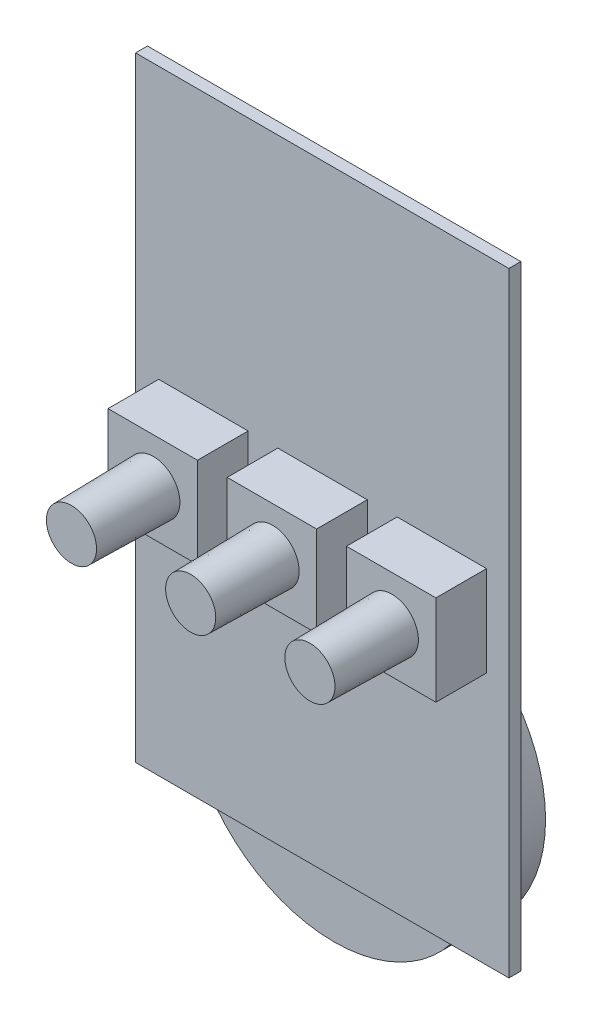
ISO-10303-21;
HEADER;
FILE_DESCRIPTION(('STEP AP214'),'2;1');
FILE_NAME('part.step','',(''),(''),'','','');
FILE_SCHEMA(('AUTOMOTIVE_DESIGN { 1 0 10303 214 1 1 1 1 }'));
ENDSEC;
DATA;
#1=APPLICATION_CONTEXT('core data for automotive mechanical design processes');
#2=APPLICATION_PROTOCOL_DEFINITION('international standard','automotive_design',2000,#1);
#3=PRODUCT_CONTEXT('',#1,'mechanical');
#4=PRODUCT('Part','Part','',(#3));
#5=PRODUCT_RELATED_PRODUCT_CATEGORY('part','',(#4));
#6=PRODUCT_DEFINITION_FORMATION('','',#4);
#7=PRODUCT_DEFINITION_CONTEXT('part definition',#1,'design');
#8=PRODUCT_DEFINITION('design','',#6,#7);
#9=PRODUCT_DEFINITION_SHAPE('','',#8);
#10=(LENGTH_UNIT() NAMED_UNIT(*) SI_UNIT(.MILLI.,.METRE.));
#11=(NAMED_UNIT(*) PLANE_ANGLE_UNIT() SI_UNIT($,.RADIAN.));
#12=(NAMED_UNIT(*) SI_UNIT($,.STERADIAN.) SOLID_ANGLE_UNIT());
#13=UNCERTAINTY_MEASURE_WITH_UNIT(LENGTH_MEASURE(1.E-05),#10,'distance_accuracy_value','');
#14=(GEOMETRIC_REPRESENTATION_CONTEXT(3) GLOBAL_UNCERTAINTY_ASSIGNED_CONTEXT((#13)) GLOBAL_UNIT_ASSIGNED_CONTEXT((#10,
#11,#12)) REPRESENTATION_CONTEXT('',''));
#15=CARTESIAN_POINT('',(0.,0.,0.));
#16=DIRECTION('',(0.,0.,1.));
#17=DIRECTION('',(1.,0.,0.));
#18=AXIS2_PLACEMENT_3D('',#15,#16,#17);
#19=CARTESIAN_POINT('',(0.,0.,3.4));
#20=DIRECTION('',(0.,0.,1.));
#21=DIRECTION('',(1.,0.,0.));
#22=AXIS2_PLACEMENT_3D('',#19,#20,#21);
#23=PLANE('',#22);
#24=DIRECTION('',(0.,-1.,0.));
#25=VECTOR('',#24,1.);
#26=CARTESIAN_POINT('',(17.5516685380828,23.0389617054669,3.4));
#27=LINE('',#26,#25);
#28=CARTESIAN_POINT('',(17.5516685380828,23.0389617054669,3.4));
#29=VERTEX_POINT('',#28);
#30=CARTESIAN_POINT('',(17.5516685380828,16.9751553210773,3.4));
#31=VERTEX_POINT('',#30);
#32=EDGE_CURVE('E375',#29,#31,#27,.T.);
#33=ORIENTED_EDGE('',*,*,#32,.T.);
#34=DIRECTION('',(1.,0.,0.));
#35=VECTOR('',#34,1.);
#36=CARTESIAN_POINT('',(17.5516685380828,16.9751553210773,3.4));
#37=LINE('',#36,#35);
#38=CARTESIAN_POINT('',(23.5516685380828,16.9751553210773,3.4));
#39=VERTEX_POINT('',#38);
#40=EDGE_CURVE('E377',#31,#39,#37,.T.);
#41=ORIENTED_EDGE('',*,*,#40,.T.);
#42=DIRECTION('',(0.,1.,0.));
#43=VECTOR('',#42,1.);
#44=CARTESIAN_POINT('',(23.5516685380828,23.0389617054669,3.4));
#45=LINE('',#44,#43);
#46=CARTESIAN_POINT('',(23.5516685380828,23.0389617054669,3.4));
#47=VERTEX_POINT('',#46);
#48=EDGE_CURVE('E380',#39,#47,#45,.T.);
#49=ORIENTED_EDGE('',*,*,#48,.T.);
#50=DIRECTION('',(-1.,0.,0.));
#51=VECTOR('',#50,1.);
#52=CARTESIAN_POINT('',(17.5516685380828,23.0389617054669,3.4));
#53=LINE('',#52,#51);
#54=EDGE_CURVE('E382',#47,#29,#53,.T.);
#55=ORIENTED_EDGE('',*,*,#54,.T.);
#56=EDGE_LOOP('',(#33,#41,#49,#55));
#57=FACE_BOUND('',#56,.T.);
#58=CARTESIAN_POINT('',(20.6,20.,3.4));
#59=DIRECTION('',(0.,0.,1.));
#60=DIRECTION('',(1.,0.,0.));
#61=AXIS2_PLACEMENT_3D('',#58,#59,#60);
#62=CIRCLE('',#61,1.778);
#63=CARTESIAN_POINT('',(22.378,20.,3.4));
#64=VERTEX_POINT('',#63);
#65=EDGE_CURVE('E416',#64,#64,#62,.T.);
#66=ORIENTED_EDGE('',*,*,#65,.F.);
#67=EDGE_LOOP('',(#66));
#68=FACE_BOUND('',#67,.T.);
#69=ADVANCED_FACE('F33',(#57,#68),#23,.T.);
#70=CARTESIAN_POINT('',(0.,0.,3.4));
#71=DIRECTION('',(0.,0.,1.));
#72=DIRECTION('',(1.,0.,0.));
#73=AXIS2_PLACEMENT_3D('',#70,#71,#72);
#74=PLANE('',#73);
#75=DIRECTION('',(0.,-1.,0.));
#76=VECTOR('',#75,1.);
#77=CARTESIAN_POINT('',(9.54638471172548,23.0389617054669,3.4));
#78=LINE('',#77,#76);
#79=CARTESIAN_POINT('',(9.54638471172548,23.0389617054669,3.4));
#80=VERTEX_POINT('',#79);
#81=CARTESIAN_POINT('',(9.54638471172548,16.9751553210773,3.4));
#82=VERTEX_POINT('',#81);
#83=EDGE_CURVE('E310',#80,#82,#78,.T.);
#84=ORIENTED_EDGE('',*,*,#83,.T.);
#85=DIRECTION('',(1.,0.,0.));
#86=VECTOR('',#85,1.);
#87=CARTESIAN_POINT('',(9.54638471172548,16.9751553210773,3.4));
#88=LINE('',#87,#86);
#89=CARTESIAN_POINT('',(15.5463847117255,16.9751553210773,3.4));
#90=VERTEX_POINT('',#89);
#91=EDGE_CURVE('E401',#82,#90,#88,.T.);
#92=ORIENTED_EDGE('',*,*,#91,.T.);
#93=DIRECTION('',(0.,1.,0.));
#94=VECTOR('',#93,1.);
#95=CARTESIAN_POINT('',(15.5463847117255,23.0389617054669,3.4));
#96=LINE('',#95,#94);
#97=CARTESIAN_POINT('',(15.5463847117255,23.0389617054669,3.4));
#98=VERTEX_POINT('',#97);
#99=EDGE_CURVE('E403',#90,#98,#96,.T.);
#100=ORIENTED_EDGE('',*,*,#99,.T.);
#101=DIRECTION('',(-1.,0.,0.));
#102=VECTOR('',#101,1.);
#103=CARTESIAN_POINT('',(9.54638471172548,23.0389617054669,3.4));
#104=LINE('',#103,#102);
#105=EDGE_CURVE('E315',#98,#80,#104,.T.);
#106=ORIENTED_EDGE('',*,*,#105,.T.);
#107=EDGE_LOOP('',(#84,#92,#100,#106));
#108=FACE_BOUND('',#107,.T.);
#109=CARTESIAN_POINT('',(12.6,20.,3.4));
#110=DIRECTION('',(0.,0.,1.));
#111=DIRECTION('',(1.,0.,0.));
#112=AXIS2_PLACEMENT_3D('',#109,#110,#111);
#113=CIRCLE('',#112,1.778);
#114=CARTESIAN_POINT('',(14.378,20.,3.4));
#115=VERTEX_POINT('',#114);
#116=EDGE_CURVE('E371',#115,#115,#113,.T.);
#117=ORIENTED_EDGE('',*,*,#116,.F.);
#118=EDGE_LOOP('',(#117));
#119=FACE_BOUND('',#118,.T.);
#120=ADVANCED_FACE('F219',(#108,#119),#74,.T.);
#121=CARTESIAN_POINT('',(0.,0.,3.4));
#122=DIRECTION('',(0.,0.,1.));
#123=DIRECTION('',(1.,0.,0.));
#124=AXIS2_PLACEMENT_3D('',#121,#122,#123);
#125=PLANE('',#124);
#126=DIRECTION('',(0.,-1.,0.));
#127=VECTOR('',#126,1.);
#128=CARTESIAN_POINT('',(1.55409918033485,23.0389617054669,3.4));
#129=LINE('',#128,#127);
#130=CARTESIAN_POINT('',(1.55409918033485,23.0389617054669,3.4));
#131=VERTEX_POINT('',#130);
#132=CARTESIAN_POINT('',(1.55409918033485,16.9751553210773,3.4));
#133=VERTEX_POINT('',#132);
#134=EDGE_CURVE('E322',#131,#133,#129,.T.);
#135=ORIENTED_EDGE('',*,*,#134,.T.);
#136=DIRECTION('',(1.,0.,0.));
#137=VECTOR('',#136,1.);
#138=CARTESIAN_POINT('',(1.55409918033485,16.9751553210773,3.4));
#139=LINE('',#138,#137);
#140=CARTESIAN_POINT('',(7.55409918033485,16.9751553210773,3.4));
#141=VERTEX_POINT('',#140);
#142=EDGE_CURVE('E325',#133,#141,#139,.T.);
#143=ORIENTED_EDGE('',*,*,#142,.T.);
#144=DIRECTION('',(0.,1.,0.));
#145=VECTOR('',#144,1.);
#146=CARTESIAN_POINT('',(7.55409918033485,23.0389617054669,3.4));
#147=LINE('',#146,#145);
#148=CARTESIAN_POINT('',(7.55409918033485,23.0389617054669,3.4));
#149=VERTEX_POINT('',#148);
#150=EDGE_CURVE('E328',#141,#149,#147,.T.);
#151=ORIENTED_EDGE('',*,*,#150,.T.);
#152=DIRECTION('',(-1.,0.,0.));
#153=VECTOR('',#152,1.);
#154=CARTESIAN_POINT('',(1.55409918033485,23.0389617054669,3.4));
#155=LINE('',#154,#153);
#156=EDGE_CURVE('E330',#149,#131,#155,.T.);
#157=ORIENTED_EDGE('',*,*,#156,.T.);
#158=EDGE_LOOP('',(#135,#143,#151,#157));
#159=FACE_BOUND('',#158,.T.);
#160=CARTESIAN_POINT('',(4.6,20.,3.4));
#161=DIRECTION('',(0.,0.,1.));
#162=DIRECTION('',(1.,0.,0.));
#163=AXIS2_PLACEMENT_3D('',#160,#161,#162);
#164=CIRCLE('',#163,1.778);
#165=CARTESIAN_POINT('',(6.378,20.,3.4));
#166=VERTEX_POINT('',#165);
#167=EDGE_CURVE('E362',#166,#166,#164,.T.);
#168=ORIENTED_EDGE('',*,*,#167,.F.);
#169=EDGE_LOOP('',(#168));
#170=FACE_BOUND('',#169,.T.);
#171=ADVANCED_FACE('F225',(#159,#170),#125,.T.);
#172=CARTESIAN_POINT('',(0.,0.,0.));
#173=DIRECTION('',(0.,0.,1.));
#174=DIRECTION('',(1.,0.,0.));
#175=AXIS2_PLACEMENT_3D('',#172,#173,#174);
#176=PLANE('',#175);
#177=DIRECTION('',(1.,0.,0.));
#178=VECTOR('',#177,1.);
#179=CARTESIAN_POINT('',(9.54638471172548,16.9751553210773,0.));
#180=LINE('',#179,#178);
#181=CARTESIAN_POINT('',(9.54638471172548,16.9751553210773,0.));
#182=VERTEX_POINT('',#181);
#183=CARTESIAN_POINT('',(15.5463847117255,16.9751553210773,0.));
#184=VERTEX_POINT('',#183);
#185=EDGE_CURVE('E294',#182,#184,#180,.T.);
#186=ORIENTED_EDGE('',*,*,#185,.F.);
#187=DIRECTION('',(0.,-1.,0.));
#188=VECTOR('',#187,1.);
#189=CARTESIAN_POINT('',(9.54638471172548,23.0389617054669,0.));
#190=LINE('',#189,#188);
#191=CARTESIAN_POINT('',(9.54638471172548,23.0389617054669,0.));
#192=VERTEX_POINT('',#191);
#193=EDGE_CURVE('E297',#192,#182,#190,.T.);
#194=ORIENTED_EDGE('',*,*,#193,.F.);
#195=DIRECTION('',(-1.,0.,0.));
#196=VECTOR('',#195,1.);
#197=CARTESIAN_POINT('',(9.54638471172548,23.0389617054669,0.));
#198=LINE('',#197,#196);
#199=CARTESIAN_POINT('',(15.5463847117255,23.0389617054669,0.));
#200=VERTEX_POINT('',#199);
#201=EDGE_CURVE('E303',#200,#192,#198,.T.);
#202=ORIENTED_EDGE('',*,*,#201,.F.);
#203=DIRECTION('',(0.,1.,0.));
#204=VECTOR('',#203,1.);
#205=CARTESIAN_POINT('',(15.5463847117255,23.0389617054669,0.));
#206=LINE('',#205,#204);
#207=EDGE_CURVE('E299',#184,#200,#206,.T.);
#208=ORIENTED_EDGE('',*,*,#207,.F.);
#209=EDGE_LOOP('',(#186,#194,#202,#208));
#210=FACE_BOUND('',#209,.T.);
#211=DIRECTION('',(0.,-1.,0.));
#212=VECTOR('',#211,1.);
#213=CARTESIAN_POINT('',(0.,41.23,0.));
#214=LINE('',#213,#212);
#215=CARTESIAN_POINT('',(0.,41.23,0.));
#216=VERTEX_POINT('',#215);
#217=CARTESIAN_POINT('',(0.,0.,0.));
#218=VERTEX_POINT('',#217);
#219=EDGE_CURVE('E182',#216,#218,#214,.T.);
#220=ORIENTED_EDGE('',*,*,#219,.T.);
#221=DIRECTION('',(1.,0.,0.));
#222=VECTOR('',#221,1.);
#223=CARTESIAN_POINT('',(0.,0.,0.));
#224=LINE('',#223,#222);
#225=CARTESIAN_POINT('',(25.05,0.,0.));
#226=VERTEX_POINT('',#225);
#227=EDGE_CURVE('E185',#218,#226,#224,.T.);
#228=ORIENTED_EDGE('',*,*,#227,.T.);
#229=DIRECTION('',(0.,1.,0.));
#230=VECTOR('',#229,1.);
#231=CARTESIAN_POINT('',(25.05,0.,0.));
#232=LINE('',#231,#230);
#233=CARTESIAN_POINT('',(25.05,41.23,0.));
#234=VERTEX_POINT('',#233);
#235=EDGE_CURVE('E189',#226,#234,#232,.T.);
#236=ORIENTED_EDGE('',*,*,#235,.T.);
#237=DIRECTION('',(-1.,0.,0.));
#238=VECTOR('',#237,1.);
#239=CARTESIAN_POINT('',(25.05,41.23,0.));
#240=LINE('',#239,#238);
#241=EDGE_CURVE('E192',#234,#216,#240,.T.);
#242=ORIENTED_EDGE('',*,*,#241,.T.);
#243=EDGE_LOOP('',(#220,#228,#236,#242));
#244=FACE_BOUND('',#243,.T.);
#245=DIRECTION('',(1.,0.,0.));
#246=VECTOR('',#245,1.);
#247=CARTESIAN_POINT('',(1.55409918033485,16.9751553210773,0.));
#248=LINE('',#247,#246);
#249=CARTESIAN_POINT('',(1.55409918033485,16.9751553210773,0.));
#250=VERTEX_POINT('',#249);
#251=CARTESIAN_POINT('',(7.55409918033485,16.9751553210773,0.));
#252=VERTEX_POINT('',#251);
#253=EDGE_CURVE('E335',#250,#252,#248,.T.);
#254=ORIENTED_EDGE('',*,*,#253,.F.);
#255=DIRECTION('',(0.,-1.,0.));
#256=VECTOR('',#255,1.);
#257=CARTESIAN_POINT('',(1.55409918033485,23.0389617054669,0.));
#258=LINE('',#257,#256);
#259=CARTESIAN_POINT('',(1.55409918033485,23.0389617054669,0.));
#260=VERTEX_POINT('',#259);
#261=EDGE_CURVE('E321',#260,#250,#258,.T.);
#262=ORIENTED_EDGE('',*,*,#261,.F.);
#263=DIRECTION('',(-1.,0.,0.));
#264=VECTOR('',#263,1.);
#265=CARTESIAN_POINT('',(1.55409918033485,23.0389617054669,0.));
#266=LINE('',#265,#264);
#267=CARTESIAN_POINT('',(7.55409918033485,23.0389617054669,0.));
#268=VERTEX_POINT('',#267);
#269=EDGE_CURVE('E326',#268,#260,#266,.T.);
#270=ORIENTED_EDGE('',*,*,#269,.F.);
#271=DIRECTION('',(0.,1.,0.));
#272=VECTOR('',#271,1.);
#273=CARTESIAN_POINT('',(7.55409918033485,23.0389617054669,0.));
#274=LINE('',#273,#272);
#275=EDGE_CURVE('E337',#252,#268,#274,.T.);
#276=ORIENTED_EDGE('',*,*,#275,.F.);
#277=EDGE_LOOP('',(#254,#262,#270,#276));
#278=FACE_BOUND('',#277,.T.);
#279=DIRECTION('',(1.,0.,0.));
#280=VECTOR('',#279,1.);
#281=CARTESIAN_POINT('',(17.5516685380828,16.9751553210773,0.));
#282=LINE('',#281,#280);
#283=CARTESIAN_POINT('',(17.5516685380828,16.9751553210773,0.));
#284=VERTEX_POINT('',#283);
#285=CARTESIAN_POINT('',(23.5516685380828,16.9751553210773,0.));
#286=VERTEX_POINT('',#285);
#287=EDGE_CURVE('E387',#284,#286,#282,.T.);
#288=ORIENTED_EDGE('',*,*,#287,.F.);
#289=DIRECTION('',(0.,-1.,0.));
#290=VECTOR('',#289,1.);
#291=CARTESIAN_POINT('',(17.5516685380828,23.0389617054669,0.));
#292=LINE('',#291,#290);
#293=CARTESIAN_POINT('',(17.5516685380828,23.0389617054669,0.));
#294=VERTEX_POINT('',#293);
#295=EDGE_CURVE('E368',#294,#284,#292,.T.);
#296=ORIENTED_EDGE('',*,*,#295,.F.);
#297=DIRECTION('',(-1.,0.,0.));
#298=VECTOR('',#297,1.);
#299=CARTESIAN_POINT('',(17.5516685380828,23.0389617054669,0.));
#300=LINE('',#299,#298);
#301=CARTESIAN_POINT('',(23.5516685380828,23.0389617054669,0.));
#302=VERTEX_POINT('',#301);
#303=EDGE_CURVE('E378',#302,#294,#300,.T.);
#304=ORIENTED_EDGE('',*,*,#303,.F.);
#305=DIRECTION('',(0.,1.,0.));
#306=VECTOR('',#305,1.);
#307=CARTESIAN_POINT('',(23.5516685380828,23.0389617054669,0.));
#308=LINE('',#307,#306);
#309=EDGE_CURVE('E389',#286,#302,#308,.T.);
#310=ORIENTED_EDGE('',*,*,#309,.F.);
#311=EDGE_LOOP('',(#288,#296,#304,#310));
#312=FACE_BOUND('',#311,.T.);
#313=ADVANCED_FACE('F204',(#210,#244,#278,#312),#176,.T.);
#314=CARTESIAN_POINT('',(0.,41.23,-0.8));
#315=DIRECTION('',(-1.,0.,0.));
#316=DIRECTION('',(0.,0.,1.));
#317=AXIS2_PLACEMENT_3D('',#314,#315,#316);
#318=PLANE('',#317);
#319=ORIENTED_EDGE('',*,*,#219,.F.);
#320=DIRECTION('',(0.,0.,1.));
#321=VECTOR('',#320,1.);
#322=CARTESIAN_POINT('',(0.,41.23,-0.8));
#323=LINE('',#322,#321);
#324=CARTESIAN_POINT('',(0.,41.23,-0.8));
#325=VERTEX_POINT('',#324);
#326=EDGE_CURVE('E42',#325,#216,#323,.T.);
#327=ORIENTED_EDGE('',*,*,#326,.F.);
#328=DIRECTION('',(0.,-1.,0.));
#329=VECTOR('',#328,1.);
#330=CARTESIAN_POINT('',(0.,41.23,-0.8));
#331=LINE('',#330,#329);
#332=CARTESIAN_POINT('',(0.,0.,-0.8));
#333=VERTEX_POINT('',#332);
#334=EDGE_CURVE('E170',#325,#333,#331,.T.);
#335=ORIENTED_EDGE('',*,*,#334,.T.);
#336=DIRECTION('',(0.,0.,1.));
#337=VECTOR('',#336,1.);
#338=CARTESIAN_POINT('',(0.,0.,-0.8));
#339=LINE('',#338,#337);
#340=EDGE_CURVE('E37',#333,#218,#339,.T.);
#341=ORIENTED_EDGE('',*,*,#340,.T.);
#342=EDGE_LOOP('',(#319,#327,#335,#341));
#343=FACE_BOUND('',#342,.T.);
#344=ADVANCED_FACE('F35',(#343),#318,.T.);
#345=CARTESIAN_POINT('',(25.05,41.23,-0.8));
#346=DIRECTION('',(0.,1.,0.));
#347=DIRECTION('',(0.,0.,1.));
#348=AXIS2_PLACEMENT_3D('',#345,#346,#347);
#349=PLANE('',#348);
#350=ORIENTED_EDGE('',*,*,#241,.F.);
#351=DIRECTION('',(0.,0.,1.));
#352=VECTOR('',#351,1.);
#353=CARTESIAN_POINT('',(25.05,41.23,-0.8));
#354=LINE('',#353,#352);
#355=CARTESIAN_POINT('',(25.05,41.23,-0.8));
#356=VERTEX_POINT('',#355);
#357=EDGE_CURVE('E196',#356,#234,#354,.T.);
#358=ORIENTED_EDGE('',*,*,#357,.F.);
#359=DIRECTION('',(-1.,0.,0.));
#360=VECTOR('',#359,1.);
#361=CARTESIAN_POINT('',(25.05,41.23,-0.8));
#362=LINE('',#361,#360);
#363=EDGE_CURVE('E179',#356,#325,#362,.T.);
#364=ORIENTED_EDGE('',*,*,#363,.T.);
#365=ORIENTED_EDGE('',*,*,#326,.T.);
#366=EDGE_LOOP('',(#350,#358,#364,#365));
#367=FACE_BOUND('',#366,.T.);
#368=ADVANCED_FACE('F208',(#367),#349,.T.);
#369=CARTESIAN_POINT('',(25.05,0.,-0.8));
#370=DIRECTION('',(1.,0.,0.));
#371=DIRECTION('',(0.,0.,-1.));
#372=AXIS2_PLACEMENT_3D('',#369,#370,#371);
#373=PLANE('',#372);
#374=ORIENTED_EDGE('',*,*,#235,.F.);
#375=DIRECTION('',(0.,0.,1.));
#376=VECTOR('',#375,1.);
#377=CARTESIAN_POINT('',(25.05,0.,-0.8));
#378=LINE('',#377,#376);
#379=CARTESIAN_POINT('',(25.05,0.,-0.8));
#380=VERTEX_POINT('',#379);
#381=EDGE_CURVE('E197',#380,#226,#378,.T.);
#382=ORIENTED_EDGE('',*,*,#381,.F.);
#383=DIRECTION('',(0.,1.,0.));
#384=VECTOR('',#383,1.);
#385=CARTESIAN_POINT('',(25.05,0.,-0.8));
#386=LINE('',#385,#384);
#387=EDGE_CURVE('E167',#380,#356,#386,.T.);
#388=ORIENTED_EDGE('',*,*,#387,.T.);
#389=ORIENTED_EDGE('',*,*,#357,.T.);
#390=EDGE_LOOP('',(#374,#382,#388,#389));
#391=FACE_BOUND('',#390,.T.);
#392=ADVANCED_FACE('F210',(#391),#373,.T.);
#393=CARTESIAN_POINT('',(0.,0.,-0.8));
#394=DIRECTION('',(0.,-1.,0.));
#395=DIRECTION('',(0.,0.,-1.));
#396=AXIS2_PLACEMENT_3D('',#393,#394,#395);
#397=PLANE('',#396);
#398=ORIENTED_EDGE('',*,*,#227,.F.);
#399=ORIENTED_EDGE('',*,*,#340,.F.);
#400=DIRECTION('',(1.,0.,0.));
#401=VECTOR('',#400,1.);
#402=CARTESIAN_POINT('',(0.,0.,-0.8));
#403=LINE('',#402,#401);
#404=CARTESIAN_POINT('',(4.11267304435512,0.,-0.8));
#405=VERTEX_POINT('',#404);
#406=EDGE_CURVE('E172',#333,#405,#403,.T.);
#407=ORIENTED_EDGE('',*,*,#406,.T.);
#408=CARTESIAN_POINT('',(20.9073269556449,0.,-0.8));
#409=VERTEX_POINT('',#408);
#410=EDGE_CURVE('E160',#405,#409,#403,.T.);
#411=ORIENTED_EDGE('',*,*,#410,.T.);
#412=EDGE_CURVE('E163',#409,#380,#403,.T.);
#413=ORIENTED_EDGE('',*,*,#412,.T.);
#414=ORIENTED_EDGE('',*,*,#381,.T.);
#415=EDGE_LOOP('',(#398,#399,#407,#411,#413,#414));
#416=FACE_BOUND('',#415,.T.);
#417=ADVANCED_FACE('F174',(#416),#397,.T.);
#418=CARTESIAN_POINT('',(0.,0.,-0.8));
#419=DIRECTION('',(0.,0.,1.));
#420=DIRECTION('',(1.,0.,0.));
#421=AXIS2_PLACEMENT_3D('',#418,#419,#420);
#422=PLANE('',#421);
#423=ORIENTED_EDGE('',*,*,#412,.F.);
#424=CARTESIAN_POINT('',(12.51,5.43,-0.8));
#425=DIRECTION('',(0.,0.,1.));
#426=DIRECTION('',(1.,0.,0.));
#427=AXIS2_PLACEMENT_3D('',#424,#425,#426);
#428=CIRCLE('',#427,10.);
#429=EDGE_CURVE('E11',#409,#405,#428,.T.);
#430=ORIENTED_EDGE('',*,*,#429,.T.);
#431=ORIENTED_EDGE('',*,*,#406,.F.);
#432=ORIENTED_EDGE('',*,*,#334,.F.);
#433=ORIENTED_EDGE('',*,*,#363,.F.);
#434=ORIENTED_EDGE('',*,*,#387,.F.);
#435=EDGE_LOOP('',(#423,#430,#431,#432,#433,#434));
#436=FACE_BOUND('',#435,.T.);
#437=ADVANCED_FACE('F164',(#436),#422,.F.);
#438=CARTESIAN_POINT('',(1.55409918033485,23.0389617054669,3.4));
#439=DIRECTION('',(1.,0.,0.));
#440=DIRECTION('',(0.,1.,0.));
#441=AXIS2_PLACEMENT_3D('',#438,#439,#440);
#442=PLANE('',#441);
#443=ORIENTED_EDGE('',*,*,#261,.T.);
#444=DIRECTION('',(0.,0.,-1.));
#445=VECTOR('',#444,1.);
#446=CARTESIAN_POINT('',(1.55409918033485,16.9751553210773,3.4));
#447=LINE('',#446,#445);
#448=EDGE_CURVE('E186',#133,#250,#447,.T.);
#449=ORIENTED_EDGE('',*,*,#448,.F.);
#450=ORIENTED_EDGE('',*,*,#134,.F.);
#451=DIRECTION('',(0.,0.,-1.));
#452=VECTOR('',#451,1.);
#453=CARTESIAN_POINT('',(1.55409918033485,23.0389617054669,3.4));
#454=LINE('',#453,#452);
#455=EDGE_CURVE('E332',#131,#260,#454,.T.);
#456=ORIENTED_EDGE('',*,*,#455,.T.);
#457=EDGE_LOOP('',(#443,#449,#450,#456));
#458=FACE_BOUND('',#457,.T.);
#459=ADVANCED_FACE('F279',(#458),#442,.F.);
#460=CARTESIAN_POINT('',(1.55409918033485,16.9751553210773,3.4));
#461=DIRECTION('',(0.,1.,0.));
#462=DIRECTION('',(0.,0.,1.));
#463=AXIS2_PLACEMENT_3D('',#460,#461,#462);
#464=PLANE('',#463);
#465=ORIENTED_EDGE('',*,*,#253,.T.);
#466=DIRECTION('',(0.,0.,-1.));
#467=VECTOR('',#466,1.);
#468=CARTESIAN_POINT('',(7.55409918033485,16.9751553210773,3.4));
#469=LINE('',#468,#467);
#470=EDGE_CURVE('E345',#141,#252,#469,.T.);
#471=ORIENTED_EDGE('',*,*,#470,.F.);
#472=ORIENTED_EDGE('',*,*,#142,.F.);
#473=ORIENTED_EDGE('',*,*,#448,.T.);
#474=EDGE_LOOP('',(#465,#471,#472,#473));
#475=FACE_BOUND('',#474,.T.);
#476=ADVANCED_FACE('F275',(#475),#464,.F.);
#477=CARTESIAN_POINT('',(7.55409918033485,23.0389617054669,3.4));
#478=DIRECTION('',(-1.,0.,0.));
#479=DIRECTION('',(0.,-1.,0.));
#480=AXIS2_PLACEMENT_3D('',#477,#478,#479);
#481=PLANE('',#480);
#482=ORIENTED_EDGE('',*,*,#275,.T.);
#483=DIRECTION('',(0.,0.,-1.));
#484=VECTOR('',#483,1.);
#485=CARTESIAN_POINT('',(7.55409918033485,23.0389617054669,3.4));
#486=LINE('',#485,#484);
#487=EDGE_CURVE('E343',#149,#268,#486,.T.);
#488=ORIENTED_EDGE('',*,*,#487,.F.);
#489=ORIENTED_EDGE('',*,*,#150,.F.);
#490=ORIENTED_EDGE('',*,*,#470,.T.);
#491=EDGE_LOOP('',(#482,#488,#489,#490));
#492=FACE_BOUND('',#491,.T.);
#493=ADVANCED_FACE('F271',(#492),#481,.F.);
#494=CARTESIAN_POINT('',(1.55409918033485,23.0389617054669,3.4));
#495=DIRECTION('',(0.,-1.,0.));
#496=DIRECTION('',(0.,0.,-1.));
#497=AXIS2_PLACEMENT_3D('',#494,#495,#496);
#498=PLANE('',#497);
#499=ORIENTED_EDGE('',*,*,#269,.T.);
#500=ORIENTED_EDGE('',*,*,#455,.F.);
#501=ORIENTED_EDGE('',*,*,#156,.F.);
#502=ORIENTED_EDGE('',*,*,#487,.T.);
#503=EDGE_LOOP('',(#499,#500,#501,#502));
#504=FACE_BOUND('',#503,.T.);
#505=ADVANCED_FACE('F264',(#504),#498,.F.);
#506=CARTESIAN_POINT('',(9.54638471172548,23.0389617054669,3.4));
#507=DIRECTION('',(1.,0.,0.));
#508=DIRECTION('',(0.,0.,-1.));
#509=AXIS2_PLACEMENT_3D('',#506,#507,#508);
#510=PLANE('',#509);
#511=ORIENTED_EDGE('',*,*,#193,.T.);
#512=DIRECTION('',(0.,0.,-1.));
#513=VECTOR('',#512,1.);
#514=CARTESIAN_POINT('',(9.54638471172548,16.9751553210773,3.4));
#515=LINE('',#514,#513);
#516=EDGE_CURVE('E319',#82,#182,#515,.T.);
#517=ORIENTED_EDGE('',*,*,#516,.F.);
#518=ORIENTED_EDGE('',*,*,#83,.F.);
#519=DIRECTION('',(0.,0.,-1.));
#520=VECTOR('',#519,1.);
#521=CARTESIAN_POINT('',(9.54638471172548,23.0389617054669,3.4));
#522=LINE('',#521,#520);
#523=EDGE_CURVE('E311',#80,#192,#522,.T.);
#524=ORIENTED_EDGE('',*,*,#523,.T.);
#525=EDGE_LOOP('',(#511,#517,#518,#524));
#526=FACE_BOUND('',#525,.T.);
#527=ADVANCED_FACE('F260',(#526),#510,.F.);
#528=CARTESIAN_POINT('',(9.54638471172548,16.9751553210773,3.4));
#529=DIRECTION('',(0.,1.,0.));
#530=DIRECTION('',(0.,0.,1.));
#531=AXIS2_PLACEMENT_3D('',#528,#529,#530);
#532=PLANE('',#531);
#533=ORIENTED_EDGE('',*,*,#185,.T.);
#534=DIRECTION('',(0.,0.,-1.));
#535=VECTOR('',#534,1.);
#536=CARTESIAN_POINT('',(15.5463847117255,16.9751553210773,3.4));
#537=LINE('',#536,#535);
#538=EDGE_CURVE('E317',#90,#184,#537,.T.);
#539=ORIENTED_EDGE('',*,*,#538,.F.);
#540=ORIENTED_EDGE('',*,*,#91,.F.);
#541=ORIENTED_EDGE('',*,*,#516,.T.);
#542=EDGE_LOOP('',(#533,#539,#540,#541));
#543=FACE_BOUND('',#542,.T.);
#544=ADVANCED_FACE('F256',(#543),#532,.F.);
#545=CARTESIAN_POINT('',(15.5463847117255,23.0389617054669,3.4));
#546=DIRECTION('',(-1.,0.,0.));
#547=DIRECTION('',(0.,0.,1.));
#548=AXIS2_PLACEMENT_3D('',#545,#546,#547);
#549=PLANE('',#548);
#550=ORIENTED_EDGE('',*,*,#207,.T.);
#551=DIRECTION('',(0.,0.,-1.));
#552=VECTOR('',#551,1.);
#553=CARTESIAN_POINT('',(15.5463847117255,23.0389617054669,3.4));
#554=LINE('',#553,#552);
#555=EDGE_CURVE('E314',#98,#200,#554,.T.);
#556=ORIENTED_EDGE('',*,*,#555,.F.);
#557=ORIENTED_EDGE('',*,*,#99,.F.);
#558=ORIENTED_EDGE('',*,*,#538,.T.);
#559=EDGE_LOOP('',(#550,#556,#557,#558));
#560=FACE_BOUND('',#559,.T.);
#561=ADVANCED_FACE('F252',(#560),#549,.F.);
#562=CARTESIAN_POINT('',(9.54638471172548,23.0389617054669,3.4));
#563=DIRECTION('',(0.,-1.,0.));
#564=DIRECTION('',(0.,0.,-1.));
#565=AXIS2_PLACEMENT_3D('',#562,#563,#564);
#566=PLANE('',#565);
#567=ORIENTED_EDGE('',*,*,#201,.T.);
#568=ORIENTED_EDGE('',*,*,#523,.F.);
#569=ORIENTED_EDGE('',*,*,#105,.F.);
#570=ORIENTED_EDGE('',*,*,#555,.T.);
#571=EDGE_LOOP('',(#567,#568,#569,#570));
#572=FACE_BOUND('',#571,.T.);
#573=ADVANCED_FACE('F247',(#572),#566,.F.);
#574=CARTESIAN_POINT('',(17.5516685380828,23.0389617054669,3.4));
#575=DIRECTION('',(1.,0.,0.));
#576=DIRECTION('',(0.,0.,-1.));
#577=AXIS2_PLACEMENT_3D('',#574,#575,#576);
#578=PLANE('',#577);
#579=ORIENTED_EDGE('',*,*,#295,.T.);
#580=DIRECTION('',(0.,0.,-1.));
#581=VECTOR('',#580,1.);
#582=CARTESIAN_POINT('',(17.5516685380828,16.9751553210773,3.4));
#583=LINE('',#582,#581);
#584=EDGE_CURVE('E305',#31,#284,#583,.T.);
#585=ORIENTED_EDGE('',*,*,#584,.F.);
#586=ORIENTED_EDGE('',*,*,#32,.F.);
#587=DIRECTION('',(0.,0.,-1.));
#588=VECTOR('',#587,1.);
#589=CARTESIAN_POINT('',(17.5516685380828,23.0389617054669,3.4));
#590=LINE('',#589,#588);
#591=EDGE_CURVE('E384',#29,#294,#590,.T.);
#592=ORIENTED_EDGE('',*,*,#591,.T.);
#593=EDGE_LOOP('',(#579,#585,#586,#592));
#594=FACE_BOUND('',#593,.T.);
#595=ADVANCED_FACE('F244',(#594),#578,.F.);
#596=CARTESIAN_POINT('',(17.5516685380828,16.9751553210773,3.4));
#597=DIRECTION('',(0.,1.,0.));
#598=DIRECTION('',(0.,0.,1.));
#599=AXIS2_PLACEMENT_3D('',#596,#597,#598);
#600=PLANE('',#599);
#601=ORIENTED_EDGE('',*,*,#287,.T.);
#602=DIRECTION('',(0.,0.,-1.));
#603=VECTOR('',#602,1.);
#604=CARTESIAN_POINT('',(23.5516685380828,16.9751553210773,3.4));
#605=LINE('',#604,#603);
#606=EDGE_CURVE('E395',#39,#286,#605,.T.);
#607=ORIENTED_EDGE('',*,*,#606,.F.);
#608=ORIENTED_EDGE('',*,*,#40,.F.);
#609=ORIENTED_EDGE('',*,*,#584,.T.);
#610=EDGE_LOOP('',(#601,#607,#608,#609));
#611=FACE_BOUND('',#610,.T.);
#612=ADVANCED_FACE('F240',(#611),#600,.F.);
#613=CARTESIAN_POINT('',(23.5516685380828,23.0389617054669,3.4));
#614=DIRECTION('',(-1.,0.,0.));
#615=DIRECTION('',(0.,0.,1.));
#616=AXIS2_PLACEMENT_3D('',#613,#614,#615);
#617=PLANE('',#616);
#618=ORIENTED_EDGE('',*,*,#309,.T.);
#619=DIRECTION('',(0.,0.,-1.));
#620=VECTOR('',#619,1.);
#621=CARTESIAN_POINT('',(23.5516685380828,23.0389617054669,3.4));
#622=LINE('',#621,#620);
#623=EDGE_CURVE('E57',#47,#302,#622,.T.);
#624=ORIENTED_EDGE('',*,*,#623,.F.);
#625=ORIENTED_EDGE('',*,*,#48,.F.);
#626=ORIENTED_EDGE('',*,*,#606,.T.);
#627=EDGE_LOOP('',(#618,#624,#625,#626));
#628=FACE_BOUND('',#627,.T.);
#629=ADVANCED_FACE('F237',(#628),#617,.F.);
#630=CARTESIAN_POINT('',(17.5516685380828,23.0389617054669,3.4));
#631=DIRECTION('',(0.,-1.,0.));
#632=DIRECTION('',(0.,0.,-1.));
#633=AXIS2_PLACEMENT_3D('',#630,#631,#632);
#634=PLANE('',#633);
#635=ORIENTED_EDGE('',*,*,#303,.T.);
#636=ORIENTED_EDGE('',*,*,#591,.F.);
#637=ORIENTED_EDGE('',*,*,#54,.F.);
#638=ORIENTED_EDGE('',*,*,#623,.T.);
#639=EDGE_LOOP('',(#635,#636,#637,#638));
#640=FACE_BOUND('',#639,.T.);
#641=ADVANCED_FACE('F234',(#640),#634,.F.);
#642=CARTESIAN_POINT('',(4.6,20.,3.4));
#643=DIRECTION('',(0.,0.,-1.));
#644=DIRECTION('',(1.,0.,0.));
#645=AXIS2_PLACEMENT_3D('',#642,#643,#644);
#646=CONICAL_SURFACE('',#645,1.778,0.0174532925199433);
#647=CARTESIAN_POINT('',(4.6,20.,8.9));
#648=DIRECTION('',(0.,0.,1.));
#649=DIRECTION('',(1.,0.,0.));
#650=AXIS2_PLACEMENT_3D('',#647,#648,#649);
#651=CIRCLE('',#650,1.6819971428948);
#652=CARTESIAN_POINT('',(6.2819971428948,20.,8.9));
#653=VERTEX_POINT('',#652);
#654=EDGE_CURVE('E364',#653,#653,#651,.T.);
#655=ORIENTED_EDGE('',*,*,#654,.F.);
#656=EDGE_LOOP('',(#655));
#657=FACE_BOUND('',#656,.T.);
#658=ORIENTED_EDGE('',*,*,#167,.T.);
#659=EDGE_LOOP('',(#658));
#660=FACE_BOUND('',#659,.T.);
#661=ADVANCED_FACE('F232',(#657,#660),#646,.T.);
#662=CARTESIAN_POINT('',(4.6,20.,8.9));
#663=DIRECTION('',(0.,0.,1.));
#664=DIRECTION('',(1.,0.,0.));
#665=AXIS2_PLACEMENT_3D('',#662,#663,#664);
#666=PLANE('',#665);
#667=ORIENTED_EDGE('',*,*,#654,.T.);
#668=EDGE_LOOP('',(#667));
#669=FACE_BOUND('',#668,.T.);
#670=ADVANCED_FACE('F449',(#669),#666,.T.);
#671=CARTESIAN_POINT('',(12.6,20.,3.4));
#672=DIRECTION('',(0.,0.,-1.));
#673=DIRECTION('',(1.,0.,0.));
#674=AXIS2_PLACEMENT_3D('',#671,#672,#673);
#675=CONICAL_SURFACE('',#674,1.778,0.0174532925199433);
#676=CARTESIAN_POINT('',(12.6,20.,8.9));
#677=DIRECTION('',(0.,0.,1.));
#678=DIRECTION('',(1.,0.,0.));
#679=AXIS2_PLACEMENT_3D('',#676,#677,#678);
#680=CIRCLE('',#679,1.6819971428948);
#681=CARTESIAN_POINT('',(14.2819971428948,20.,8.9));
#682=VERTEX_POINT('',#681);
#683=EDGE_CURVE('E365',#682,#682,#680,.T.);
#684=ORIENTED_EDGE('',*,*,#683,.F.);
#685=EDGE_LOOP('',(#684));
#686=FACE_BOUND('',#685,.T.);
#687=ORIENTED_EDGE('',*,*,#116,.T.);
#688=EDGE_LOOP('',(#687));
#689=FACE_BOUND('',#688,.T.);
#690=ADVANCED_FACE('F446',(#686,#689),#675,.T.);
#691=CARTESIAN_POINT('',(12.6,20.,8.9));
#692=DIRECTION('',(0.,0.,1.));
#693=DIRECTION('',(1.,0.,0.));
#694=AXIS2_PLACEMENT_3D('',#691,#692,#693);
#695=PLANE('',#694);
#696=ORIENTED_EDGE('',*,*,#683,.T.);
#697=EDGE_LOOP('',(#696));
#698=FACE_BOUND('',#697,.T.);
#699=ADVANCED_FACE('F442',(#698),#695,.T.);
#700=CARTESIAN_POINT('',(20.6,20.,3.4));
#701=DIRECTION('',(0.,0.,-1.));
#702=DIRECTION('',(1.,0.,0.));
#703=AXIS2_PLACEMENT_3D('',#700,#701,#702);
#704=CONICAL_SURFACE('',#703,1.778,0.0174532925199433);
#705=CARTESIAN_POINT('',(20.6,20.,8.9));
#706=DIRECTION('',(0.,0.,1.));
#707=DIRECTION('',(1.,0.,0.));
#708=AXIS2_PLACEMENT_3D('',#705,#706,#707);
#709=CIRCLE('',#708,1.6819971428948);
#710=CARTESIAN_POINT('',(22.2819971428948,20.,8.9));
#711=VERTEX_POINT('',#710);
#712=EDGE_CURVE('E414',#711,#711,#709,.T.);
#713=ORIENTED_EDGE('',*,*,#712,.F.);
#714=EDGE_LOOP('',(#713));
#715=FACE_BOUND('',#714,.T.);
#716=ORIENTED_EDGE('',*,*,#65,.T.);
#717=EDGE_LOOP('',(#716));
#718=FACE_BOUND('',#717,.T.);
#719=ADVANCED_FACE('F438',(#715,#718),#704,.T.);
#720=CARTESIAN_POINT('',(20.6,20.,8.9));
#721=DIRECTION('',(0.,0.,1.));
#722=DIRECTION('',(1.,0.,0.));
#723=AXIS2_PLACEMENT_3D('',#720,#721,#722);
#724=PLANE('',#723);
#725=ORIENTED_EDGE('',*,*,#712,.T.);
#726=EDGE_LOOP('',(#725));
#727=FACE_BOUND('',#726,.T.);
#728=ADVANCED_FACE('F434',(#727),#724,.T.);
#729=CARTESIAN_POINT('',(12.51,5.43,-0.8));
#730=DIRECTION('',(0.,0.,1.));
#731=DIRECTION('',(1.,0.,0.));
#732=AXIS2_PLACEMENT_3D('',#729,#730,#731);
#733=PLANE('',#732);
#734=ORIENTED_EDGE('',*,*,#410,.F.);
#735=EDGE_CURVE('E44',#405,#409,#428,.T.);
#736=ORIENTED_EDGE('',*,*,#735,.T.);
#737=EDGE_LOOP('',(#734,#736));
#738=FACE_BOUND('',#737,.T.);
#739=ADVANCED_FACE('F158',(#738),#733,.T.);
#740=CARTESIAN_POINT('',(12.51,5.43,-5.));
#741=DIRECTION('',(0.,0.,1.));
#742=DIRECTION('',(1.,0.,0.));
#743=AXIS2_PLACEMENT_3D('',#740,#741,#742);
#744=CYLINDRICAL_SURFACE('',#743,10.);
#745=CARTESIAN_POINT('',(12.51,5.43,-5.));
#746=DIRECTION('',(0.,0.,1.));
#747=DIRECTION('',(1.,0.,0.));
#748=AXIS2_PLACEMENT_3D('',#745,#746,#747);
#749=CIRCLE('',#748,10.);
#750=CARTESIAN_POINT('',(22.51,5.43,-5.));
#751=VERTEX_POINT('',#750);
#752=EDGE_CURVE('E161',#751,#751,#749,.T.);
#753=ORIENTED_EDGE('',*,*,#752,.T.);
#754=EDGE_LOOP('',(#753));
#755=FACE_BOUND('',#754,.T.);
#756=ORIENTED_EDGE('',*,*,#735,.F.);
#757=ORIENTED_EDGE('',*,*,#429,.F.);
#758=EDGE_LOOP('',(#756,#757));
#759=FACE_BOUND('',#758,.T.);
#760=ADVANCED_FACE('F152',(#755,#759),#744,.T.);
#761=CARTESIAN_POINT('',(12.51,5.43,-5.));
#762=DIRECTION('',(0.,0.,1.));
#763=DIRECTION('',(1.,0.,0.));
#764=AXIS2_PLACEMENT_3D('',#761,#762,#763);
#765=PLANE('',#764);
#766=ORIENTED_EDGE('',*,*,#752,.F.);
#767=EDGE_LOOP('',(#766));
#768=FACE_BOUND('',#767,.T.);
#769=ADVANCED_FACE('F425',(#768),#765,.F.);
#770=CLOSED_SHELL('',(#69,#120,#171,#313,#344,#368,#392,#417,#437,#459,#476,#493,#505,#527,#544,
#561,#573,#595,#612,#629,#641,#661,#670,#690,#699,#719,#728,#739,#760,#769));
#771=MANIFOLD_SOLID_BREP('B2',#770);
#772=ADVANCED_BREP_SHAPE_REPRESENTATION('',(#18,#771),#14);
#773=SHAPE_DEFINITION_REPRESENTATION(#9,#772);
ENDSEC;
END-ISO-10303-21;
